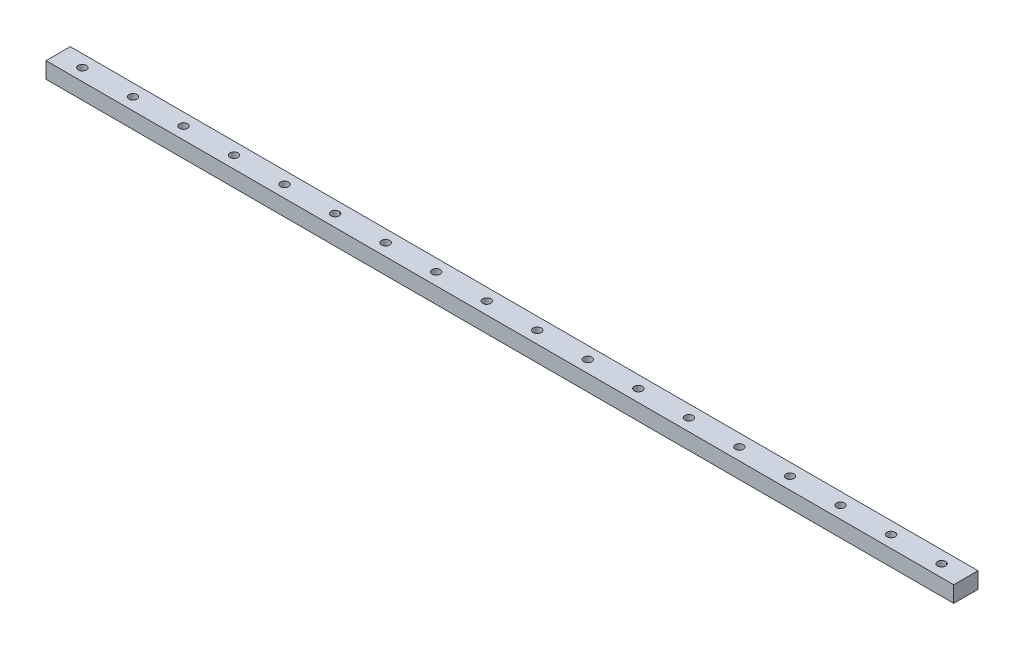
ISO-10303-21;
HEADER;
FILE_DESCRIPTION(('STEP AP214'),'2;1');
FILE_NAME('part.step','',(''),(''),'','','');
FILE_SCHEMA(('AUTOMOTIVE_DESIGN { 1 0 10303 214 1 1 1 1 }'));
ENDSEC;
DATA;
#1=APPLICATION_CONTEXT('core data for automotive mechanical design processes');
#2=APPLICATION_PROTOCOL_DEFINITION('international standard','automotive_design',2000,#1);
#3=PRODUCT_CONTEXT('',#1,'mechanical');
#4=PRODUCT('Part','Part','',(#3));
#5=PRODUCT_RELATED_PRODUCT_CATEGORY('part','',(#4));
#6=PRODUCT_DEFINITION_FORMATION('','',#4);
#7=PRODUCT_DEFINITION_CONTEXT('part definition',#1,'design');
#8=PRODUCT_DEFINITION('design','',#6,#7);
#9=PRODUCT_DEFINITION_SHAPE('','',#8);
#10=(LENGTH_UNIT() NAMED_UNIT(*) SI_UNIT(.MILLI.,.METRE.));
#11=(NAMED_UNIT(*) PLANE_ANGLE_UNIT() SI_UNIT($,.RADIAN.));
#12=(NAMED_UNIT(*) SI_UNIT($,.STERADIAN.) SOLID_ANGLE_UNIT());
#13=UNCERTAINTY_MEASURE_WITH_UNIT(LENGTH_MEASURE(1.E-05),#10,'distance_accuracy_value','');
#14=(GEOMETRIC_REPRESENTATION_CONTEXT(3) GLOBAL_UNCERTAINTY_ASSIGNED_CONTEXT((#13)) GLOBAL_UNIT_ASSIGNED_CONTEXT((#10,
#11,#12)) REPRESENTATION_CONTEXT('',''));
#15=CARTESIAN_POINT('',(0.,0.,0.));
#16=DIRECTION('',(0.,0.,1.));
#17=DIRECTION('',(1.,0.,0.));
#18=AXIS2_PLACEMENT_3D('',#15,#16,#17);
#19=CARTESIAN_POINT('',(0.,8.,0.));
#20=DIRECTION('',(0.,-1.,0.));
#21=DIRECTION('',(0.,0.,-1.));
#22=AXIS2_PLACEMENT_3D('',#19,#20,#21);
#23=PLANE('',#22);
#24=DIRECTION('',(0.,0.,1.));
#25=VECTOR('',#24,1.);
#26=CARTESIAN_POINT('',(0.,8.,0.));
#27=LINE('',#26,#25);
#28=CARTESIAN_POINT('',(0.,8.,-12.));
#29=VERTEX_POINT('',#28);
#30=CARTESIAN_POINT('',(0.,8.,0.));
#31=VERTEX_POINT('',#30);
#32=EDGE_CURVE('E98',#29,#31,#27,.T.);
#33=ORIENTED_EDGE('',*,*,#32,.T.);
#34=DIRECTION('',(1.,0.,0.));
#35=VECTOR('',#34,1.);
#36=CARTESIAN_POINT('',(0.,8.,0.));
#37=LINE('',#36,#35);
#38=CARTESIAN_POINT('',(449.,8.,0.));
#39=VERTEX_POINT('',#38);
#40=EDGE_CURVE('E93',#31,#39,#37,.T.);
#41=ORIENTED_EDGE('',*,*,#40,.T.);
#42=DIRECTION('',(0.,0.,-1.));
#43=VECTOR('',#42,1.);
#44=CARTESIAN_POINT('',(449.,8.,0.));
#45=LINE('',#44,#43);
#46=CARTESIAN_POINT('',(449.,8.,-12.));
#47=VERTEX_POINT('',#46);
#48=EDGE_CURVE('E96',#39,#47,#45,.T.);
#49=ORIENTED_EDGE('',*,*,#48,.T.);
#50=DIRECTION('',(-1.,0.,0.));
#51=VECTOR('',#50,1.);
#52=CARTESIAN_POINT('',(0.,8.,-12.));
#53=LINE('',#52,#51);
#54=EDGE_CURVE('E63',#47,#29,#53,.T.);
#55=ORIENTED_EDGE('',*,*,#54,.T.);
#56=EDGE_LOOP('',(#33,#41,#49,#55));
#57=FACE_BOUND('',#56,.T.);
#58=CARTESIAN_POINT('',(12.,8.,-6.));
#59=DIRECTION('',(0.,1.,0.));
#60=DIRECTION('',(0.,0.,1.));
#61=AXIS2_PLACEMENT_3D('',#58,#59,#60);
#62=CIRCLE('',#61,2.);
#63=CARTESIAN_POINT('',(12.,8.,-4.));
#64=VERTEX_POINT('',#63);
#65=EDGE_CURVE('E118',#64,#64,#62,.T.);
#66=ORIENTED_EDGE('',*,*,#65,.F.);
#67=EDGE_LOOP('',(#66));
#68=FACE_BOUND('',#67,.T.);
#69=CARTESIAN_POINT('',(37.,8.,-6.));
#70=DIRECTION('',(0.,1.,0.));
#71=DIRECTION('',(0.,0.,1.));
#72=AXIS2_PLACEMENT_3D('',#69,#70,#71);
#73=CIRCLE('',#72,2.);
#74=CARTESIAN_POINT('',(37.,8.,-4.));
#75=VERTEX_POINT('',#74);
#76=EDGE_CURVE('E140',#75,#75,#73,.T.);
#77=ORIENTED_EDGE('',*,*,#76,.F.);
#78=EDGE_LOOP('',(#77));
#79=FACE_BOUND('',#78,.T.);
#80=CARTESIAN_POINT('',(62.,8.,-6.));
#81=DIRECTION('',(0.,1.,0.));
#82=DIRECTION('',(0.,0.,1.));
#83=AXIS2_PLACEMENT_3D('',#80,#81,#82);
#84=CIRCLE('',#83,2.);
#85=CARTESIAN_POINT('',(62.,8.,-4.));
#86=VERTEX_POINT('',#85);
#87=EDGE_CURVE('E148',#86,#86,#84,.T.);
#88=ORIENTED_EDGE('',*,*,#87,.F.);
#89=EDGE_LOOP('',(#88));
#90=FACE_BOUND('',#89,.T.);
#91=CARTESIAN_POINT('',(87.,8.,-6.));
#92=DIRECTION('',(0.,1.,0.));
#93=DIRECTION('',(0.,0.,1.));
#94=AXIS2_PLACEMENT_3D('',#91,#92,#93);
#95=CIRCLE('',#94,2.00000000000001);
#96=CARTESIAN_POINT('',(87.,8.,-3.99999999999999));
#97=VERTEX_POINT('',#96);
#98=EDGE_CURVE('E156',#97,#97,#95,.T.);
#99=ORIENTED_EDGE('',*,*,#98,.F.);
#100=EDGE_LOOP('',(#99));
#101=FACE_BOUND('',#100,.T.);
#102=CARTESIAN_POINT('',(112.,8.,-6.));
#103=DIRECTION('',(0.,1.,0.));
#104=DIRECTION('',(0.,0.,1.));
#105=AXIS2_PLACEMENT_3D('',#102,#103,#104);
#106=CIRCLE('',#105,2.00000000000001);
#107=CARTESIAN_POINT('',(112.,8.,-3.99999999999999));
#108=VERTEX_POINT('',#107);
#109=EDGE_CURVE('E164',#108,#108,#106,.T.);
#110=ORIENTED_EDGE('',*,*,#109,.F.);
#111=EDGE_LOOP('',(#110));
#112=FACE_BOUND('',#111,.T.);
#113=CARTESIAN_POINT('',(137.,8.,-6.));
#114=DIRECTION('',(0.,1.,0.));
#115=DIRECTION('',(0.,0.,1.));
#116=AXIS2_PLACEMENT_3D('',#113,#114,#115);
#117=CIRCLE('',#116,2.);
#118=CARTESIAN_POINT('',(137.,8.,-4.));
#119=VERTEX_POINT('',#118);
#120=EDGE_CURVE('E172',#119,#119,#117,.T.);
#121=ORIENTED_EDGE('',*,*,#120,.F.);
#122=EDGE_LOOP('',(#121));
#123=FACE_BOUND('',#122,.T.);
#124=CARTESIAN_POINT('',(162.,8.,-6.));
#125=DIRECTION('',(0.,1.,0.));
#126=DIRECTION('',(0.,0.,1.));
#127=AXIS2_PLACEMENT_3D('',#124,#125,#126);
#128=CIRCLE('',#127,2.);
#129=CARTESIAN_POINT('',(162.,8.,-4.));
#130=VERTEX_POINT('',#129);
#131=EDGE_CURVE('E180',#130,#130,#128,.T.);
#132=ORIENTED_EDGE('',*,*,#131,.F.);
#133=EDGE_LOOP('',(#132));
#134=FACE_BOUND('',#133,.T.);
#135=CARTESIAN_POINT('',(187.,8.,-6.));
#136=DIRECTION('',(0.,1.,0.));
#137=DIRECTION('',(0.,0.,1.));
#138=AXIS2_PLACEMENT_3D('',#135,#136,#137);
#139=CIRCLE('',#138,2.);
#140=CARTESIAN_POINT('',(187.,8.,-4.));
#141=VERTEX_POINT('',#140);
#142=EDGE_CURVE('E188',#141,#141,#139,.T.);
#143=ORIENTED_EDGE('',*,*,#142,.F.);
#144=EDGE_LOOP('',(#143));
#145=FACE_BOUND('',#144,.T.);
#146=CARTESIAN_POINT('',(212.,8.,-6.));
#147=DIRECTION('',(0.,1.,0.));
#148=DIRECTION('',(0.,0.,1.));
#149=AXIS2_PLACEMENT_3D('',#146,#147,#148);
#150=CIRCLE('',#149,2.);
#151=CARTESIAN_POINT('',(212.,8.,-4.));
#152=VERTEX_POINT('',#151);
#153=EDGE_CURVE('E196',#152,#152,#150,.T.);
#154=ORIENTED_EDGE('',*,*,#153,.F.);
#155=EDGE_LOOP('',(#154));
#156=FACE_BOUND('',#155,.T.);
#157=CARTESIAN_POINT('',(237.,8.,-6.));
#158=DIRECTION('',(0.,1.,0.));
#159=DIRECTION('',(0.,0.,1.));
#160=AXIS2_PLACEMENT_3D('',#157,#158,#159);
#161=CIRCLE('',#160,2.);
#162=CARTESIAN_POINT('',(237.,8.,-4.));
#163=VERTEX_POINT('',#162);
#164=EDGE_CURVE('E204',#163,#163,#161,.T.);
#165=ORIENTED_EDGE('',*,*,#164,.F.);
#166=EDGE_LOOP('',(#165));
#167=FACE_BOUND('',#166,.T.);
#168=CARTESIAN_POINT('',(262.,8.,-6.));
#169=DIRECTION('',(0.,1.,0.));
#170=DIRECTION('',(0.,0.,1.));
#171=AXIS2_PLACEMENT_3D('',#168,#169,#170);
#172=CIRCLE('',#171,2.);
#173=CARTESIAN_POINT('',(262.,8.,-4.));
#174=VERTEX_POINT('',#173);
#175=EDGE_CURVE('E212',#174,#174,#172,.T.);
#176=ORIENTED_EDGE('',*,*,#175,.F.);
#177=EDGE_LOOP('',(#176));
#178=FACE_BOUND('',#177,.T.);
#179=CARTESIAN_POINT('',(287.,8.,-6.));
#180=DIRECTION('',(0.,1.,0.));
#181=DIRECTION('',(0.,0.,1.));
#182=AXIS2_PLACEMENT_3D('',#179,#180,#181);
#183=CIRCLE('',#182,2.);
#184=CARTESIAN_POINT('',(287.,8.,-4.));
#185=VERTEX_POINT('',#184);
#186=EDGE_CURVE('E220',#185,#185,#183,.T.);
#187=ORIENTED_EDGE('',*,*,#186,.F.);
#188=EDGE_LOOP('',(#187));
#189=FACE_BOUND('',#188,.T.);
#190=CARTESIAN_POINT('',(312.,8.,-6.));
#191=DIRECTION('',(0.,1.,0.));
#192=DIRECTION('',(0.,0.,1.));
#193=AXIS2_PLACEMENT_3D('',#190,#191,#192);
#194=CIRCLE('',#193,2.);
#195=CARTESIAN_POINT('',(312.,8.,-4.));
#196=VERTEX_POINT('',#195);
#197=EDGE_CURVE('E228',#196,#196,#194,.T.);
#198=ORIENTED_EDGE('',*,*,#197,.F.);
#199=EDGE_LOOP('',(#198));
#200=FACE_BOUND('',#199,.T.);
#201=CARTESIAN_POINT('',(337.,8.,-6.));
#202=DIRECTION('',(0.,1.,0.));
#203=DIRECTION('',(0.,0.,1.));
#204=AXIS2_PLACEMENT_3D('',#201,#202,#203);
#205=CIRCLE('',#204,2.);
#206=CARTESIAN_POINT('',(337.,8.,-4.));
#207=VERTEX_POINT('',#206);
#208=EDGE_CURVE('E236',#207,#207,#205,.T.);
#209=ORIENTED_EDGE('',*,*,#208,.F.);
#210=EDGE_LOOP('',(#209));
#211=FACE_BOUND('',#210,.T.);
#212=CARTESIAN_POINT('',(362.,8.,-6.));
#213=DIRECTION('',(0.,1.,0.));
#214=DIRECTION('',(0.,0.,1.));
#215=AXIS2_PLACEMENT_3D('',#212,#213,#214);
#216=CIRCLE('',#215,2.);
#217=CARTESIAN_POINT('',(362.,8.,-4.));
#218=VERTEX_POINT('',#217);
#219=EDGE_CURVE('E244',#218,#218,#216,.T.);
#220=ORIENTED_EDGE('',*,*,#219,.F.);
#221=EDGE_LOOP('',(#220));
#222=FACE_BOUND('',#221,.T.);
#223=CARTESIAN_POINT('',(387.,8.,-6.));
#224=DIRECTION('',(0.,1.,0.));
#225=DIRECTION('',(0.,0.,1.));
#226=AXIS2_PLACEMENT_3D('',#223,#224,#225);
#227=CIRCLE('',#226,2.);
#228=CARTESIAN_POINT('',(387.,8.,-4.));
#229=VERTEX_POINT('',#228);
#230=EDGE_CURVE('E252',#229,#229,#227,.T.);
#231=ORIENTED_EDGE('',*,*,#230,.F.);
#232=EDGE_LOOP('',(#231));
#233=FACE_BOUND('',#232,.T.);
#234=CARTESIAN_POINT('',(412.,8.,-6.));
#235=DIRECTION('',(0.,1.,0.));
#236=DIRECTION('',(0.,0.,1.));
#237=AXIS2_PLACEMENT_3D('',#234,#235,#236);
#238=CIRCLE('',#237,2.);
#239=CARTESIAN_POINT('',(412.,8.,-4.));
#240=VERTEX_POINT('',#239);
#241=EDGE_CURVE('E260',#240,#240,#238,.T.);
#242=ORIENTED_EDGE('',*,*,#241,.F.);
#243=EDGE_LOOP('',(#242));
#244=FACE_BOUND('',#243,.T.);
#245=CARTESIAN_POINT('',(437.,8.,-6.));
#246=DIRECTION('',(0.,1.,0.));
#247=DIRECTION('',(0.,0.,1.));
#248=AXIS2_PLACEMENT_3D('',#245,#246,#247);
#249=CIRCLE('',#248,2.);
#250=CARTESIAN_POINT('',(437.,8.,-4.));
#251=VERTEX_POINT('',#250);
#252=EDGE_CURVE('E268',#251,#251,#249,.T.);
#253=ORIENTED_EDGE('',*,*,#252,.F.);
#254=EDGE_LOOP('',(#253));
#255=FACE_BOUND('',#254,.T.);
#256=ADVANCED_FACE('F45',(#57,#68,#79,#90,#101,#112,#123,#134,#145,#156,#167,#178,#189,#200,
#211,#222,#233,#244,#255),#23,.F.);
#257=CARTESIAN_POINT('',(0.,0.,0.));
#258=DIRECTION('',(0.,-1.,0.));
#259=DIRECTION('',(0.,0.,-1.));
#260=AXIS2_PLACEMENT_3D('',#257,#258,#259);
#261=PLANE('',#260);
#262=CARTESIAN_POINT('',(412.,0.,-6.));
#263=DIRECTION('',(0.,1.,0.));
#264=DIRECTION('',(0.,0.,1.));
#265=AXIS2_PLACEMENT_3D('',#262,#263,#264);
#266=CIRCLE('',#265,2.);
#267=CARTESIAN_POINT('',(412.,0.,-4.));
#268=VERTEX_POINT('',#267);
#269=EDGE_CURVE('E264',#268,#268,#266,.T.);
#270=ORIENTED_EDGE('',*,*,#269,.T.);
#271=EDGE_LOOP('',(#270));
#272=FACE_BOUND('',#271,.T.);
#273=CARTESIAN_POINT('',(362.,0.,-6.));
#274=DIRECTION('',(0.,1.,0.));
#275=DIRECTION('',(0.,0.,1.));
#276=AXIS2_PLACEMENT_3D('',#273,#274,#275);
#277=CIRCLE('',#276,2.);
#278=CARTESIAN_POINT('',(362.,0.,-4.));
#279=VERTEX_POINT('',#278);
#280=EDGE_CURVE('E248',#279,#279,#277,.T.);
#281=ORIENTED_EDGE('',*,*,#280,.T.);
#282=EDGE_LOOP('',(#281));
#283=FACE_BOUND('',#282,.T.);
#284=CARTESIAN_POINT('',(312.,0.,-6.));
#285=DIRECTION('',(0.,1.,0.));
#286=DIRECTION('',(0.,0.,1.));
#287=AXIS2_PLACEMENT_3D('',#284,#285,#286);
#288=CIRCLE('',#287,2.);
#289=CARTESIAN_POINT('',(312.,0.,-4.));
#290=VERTEX_POINT('',#289);
#291=EDGE_CURVE('E232',#290,#290,#288,.T.);
#292=ORIENTED_EDGE('',*,*,#291,.T.);
#293=EDGE_LOOP('',(#292));
#294=FACE_BOUND('',#293,.T.);
#295=CARTESIAN_POINT('',(262.,0.,-6.));
#296=DIRECTION('',(0.,1.,0.));
#297=DIRECTION('',(0.,0.,1.));
#298=AXIS2_PLACEMENT_3D('',#295,#296,#297);
#299=CIRCLE('',#298,2.);
#300=CARTESIAN_POINT('',(262.,0.,-4.));
#301=VERTEX_POINT('',#300);
#302=EDGE_CURVE('E216',#301,#301,#299,.T.);
#303=ORIENTED_EDGE('',*,*,#302,.T.);
#304=EDGE_LOOP('',(#303));
#305=FACE_BOUND('',#304,.T.);
#306=CARTESIAN_POINT('',(212.,0.,-6.));
#307=DIRECTION('',(0.,1.,0.));
#308=DIRECTION('',(0.,0.,1.));
#309=AXIS2_PLACEMENT_3D('',#306,#307,#308);
#310=CIRCLE('',#309,2.);
#311=CARTESIAN_POINT('',(212.,0.,-4.));
#312=VERTEX_POINT('',#311);
#313=EDGE_CURVE('E200',#312,#312,#310,.T.);
#314=ORIENTED_EDGE('',*,*,#313,.T.);
#315=EDGE_LOOP('',(#314));
#316=FACE_BOUND('',#315,.T.);
#317=CARTESIAN_POINT('',(162.,0.,-6.));
#318=DIRECTION('',(0.,1.,0.));
#319=DIRECTION('',(0.,0.,1.));
#320=AXIS2_PLACEMENT_3D('',#317,#318,#319);
#321=CIRCLE('',#320,2.);
#322=CARTESIAN_POINT('',(162.,0.,-4.));
#323=VERTEX_POINT('',#322);
#324=EDGE_CURVE('E184',#323,#323,#321,.T.);
#325=ORIENTED_EDGE('',*,*,#324,.T.);
#326=EDGE_LOOP('',(#325));
#327=FACE_BOUND('',#326,.T.);
#328=CARTESIAN_POINT('',(112.,0.,-6.));
#329=DIRECTION('',(0.,1.,0.));
#330=DIRECTION('',(0.,0.,1.));
#331=AXIS2_PLACEMENT_3D('',#328,#329,#330);
#332=CIRCLE('',#331,2.00000000000001);
#333=CARTESIAN_POINT('',(112.,0.,-3.99999999999999));
#334=VERTEX_POINT('',#333);
#335=EDGE_CURVE('E168',#334,#334,#332,.T.);
#336=ORIENTED_EDGE('',*,*,#335,.T.);
#337=EDGE_LOOP('',(#336));
#338=FACE_BOUND('',#337,.T.);
#339=CARTESIAN_POINT('',(62.,0.,-6.));
#340=DIRECTION('',(0.,1.,0.));
#341=DIRECTION('',(0.,0.,1.));
#342=AXIS2_PLACEMENT_3D('',#339,#340,#341);
#343=CIRCLE('',#342,2.);
#344=CARTESIAN_POINT('',(62.,0.,-4.));
#345=VERTEX_POINT('',#344);
#346=EDGE_CURVE('E152',#345,#345,#343,.T.);
#347=ORIENTED_EDGE('',*,*,#346,.T.);
#348=EDGE_LOOP('',(#347));
#349=FACE_BOUND('',#348,.T.);
#350=CARTESIAN_POINT('',(12.,0.,-6.));
#351=DIRECTION('',(0.,1.,0.));
#352=DIRECTION('',(0.,0.,1.));
#353=AXIS2_PLACEMENT_3D('',#350,#351,#352);
#354=CIRCLE('',#353,2.);
#355=CARTESIAN_POINT('',(12.,0.,-4.));
#356=VERTEX_POINT('',#355);
#357=EDGE_CURVE('E136',#356,#356,#354,.T.);
#358=ORIENTED_EDGE('',*,*,#357,.T.);
#359=EDGE_LOOP('',(#358));
#360=FACE_BOUND('',#359,.T.);
#361=DIRECTION('',(0.,0.,1.));
#362=VECTOR('',#361,1.);
#363=CARTESIAN_POINT('',(0.,0.,0.));
#364=LINE('',#363,#362);
#365=CARTESIAN_POINT('',(0.,0.,-12.));
#366=VERTEX_POINT('',#365);
#367=CARTESIAN_POINT('',(0.,0.,0.));
#368=VERTEX_POINT('',#367);
#369=EDGE_CURVE('E114',#366,#368,#364,.T.);
#370=ORIENTED_EDGE('',*,*,#369,.F.);
#371=DIRECTION('',(-1.,0.,0.));
#372=VECTOR('',#371,1.);
#373=CARTESIAN_POINT('',(0.,0.,-12.));
#374=LINE('',#373,#372);
#375=CARTESIAN_POINT('',(449.,0.,-12.));
#376=VERTEX_POINT('',#375);
#377=EDGE_CURVE('E86',#376,#366,#374,.T.);
#378=ORIENTED_EDGE('',*,*,#377,.F.);
#379=DIRECTION('',(0.,0.,-1.));
#380=VECTOR('',#379,1.);
#381=CARTESIAN_POINT('',(449.,0.,0.));
#382=LINE('',#381,#380);
#383=CARTESIAN_POINT('',(449.,0.,0.));
#384=VERTEX_POINT('',#383);
#385=EDGE_CURVE('E80',#384,#376,#382,.T.);
#386=ORIENTED_EDGE('',*,*,#385,.F.);
#387=DIRECTION('',(1.,0.,0.));
#388=VECTOR('',#387,1.);
#389=CARTESIAN_POINT('',(0.,0.,0.));
#390=LINE('',#389,#388);
#391=EDGE_CURVE('E103',#368,#384,#390,.T.);
#392=ORIENTED_EDGE('',*,*,#391,.F.);
#393=EDGE_LOOP('',(#370,#378,#386,#392));
#394=FACE_BOUND('',#393,.T.);
#395=CARTESIAN_POINT('',(37.,0.,-6.));
#396=DIRECTION('',(0.,1.,0.));
#397=DIRECTION('',(0.,0.,1.));
#398=AXIS2_PLACEMENT_3D('',#395,#396,#397);
#399=CIRCLE('',#398,2.);
#400=CARTESIAN_POINT('',(37.,0.,-4.));
#401=VERTEX_POINT('',#400);
#402=EDGE_CURVE('E144',#401,#401,#399,.T.);
#403=ORIENTED_EDGE('',*,*,#402,.T.);
#404=EDGE_LOOP('',(#403));
#405=FACE_BOUND('',#404,.T.);
#406=CARTESIAN_POINT('',(87.,0.,-6.));
#407=DIRECTION('',(0.,1.,0.));
#408=DIRECTION('',(0.,0.,1.));
#409=AXIS2_PLACEMENT_3D('',#406,#407,#408);
#410=CIRCLE('',#409,2.00000000000001);
#411=CARTESIAN_POINT('',(87.,0.,-3.99999999999999));
#412=VERTEX_POINT('',#411);
#413=EDGE_CURVE('E160',#412,#412,#410,.T.);
#414=ORIENTED_EDGE('',*,*,#413,.T.);
#415=EDGE_LOOP('',(#414));
#416=FACE_BOUND('',#415,.T.);
#417=CARTESIAN_POINT('',(137.,0.,-6.));
#418=DIRECTION('',(0.,1.,0.));
#419=DIRECTION('',(0.,0.,1.));
#420=AXIS2_PLACEMENT_3D('',#417,#418,#419);
#421=CIRCLE('',#420,2.);
#422=CARTESIAN_POINT('',(137.,0.,-4.));
#423=VERTEX_POINT('',#422);
#424=EDGE_CURVE('E176',#423,#423,#421,.T.);
#425=ORIENTED_EDGE('',*,*,#424,.T.);
#426=EDGE_LOOP('',(#425));
#427=FACE_BOUND('',#426,.T.);
#428=CARTESIAN_POINT('',(187.,0.,-6.));
#429=DIRECTION('',(0.,1.,0.));
#430=DIRECTION('',(0.,0.,1.));
#431=AXIS2_PLACEMENT_3D('',#428,#429,#430);
#432=CIRCLE('',#431,2.);
#433=CARTESIAN_POINT('',(187.,0.,-4.));
#434=VERTEX_POINT('',#433);
#435=EDGE_CURVE('E192',#434,#434,#432,.T.);
#436=ORIENTED_EDGE('',*,*,#435,.T.);
#437=EDGE_LOOP('',(#436));
#438=FACE_BOUND('',#437,.T.);
#439=CARTESIAN_POINT('',(237.,0.,-6.));
#440=DIRECTION('',(0.,1.,0.));
#441=DIRECTION('',(0.,0.,1.));
#442=AXIS2_PLACEMENT_3D('',#439,#440,#441);
#443=CIRCLE('',#442,2.);
#444=CARTESIAN_POINT('',(237.,0.,-4.));
#445=VERTEX_POINT('',#444);
#446=EDGE_CURVE('E208',#445,#445,#443,.T.);
#447=ORIENTED_EDGE('',*,*,#446,.T.);
#448=EDGE_LOOP('',(#447));
#449=FACE_BOUND('',#448,.T.);
#450=CARTESIAN_POINT('',(287.,0.,-6.));
#451=DIRECTION('',(0.,1.,0.));
#452=DIRECTION('',(0.,0.,1.));
#453=AXIS2_PLACEMENT_3D('',#450,#451,#452);
#454=CIRCLE('',#453,2.);
#455=CARTESIAN_POINT('',(287.,0.,-4.));
#456=VERTEX_POINT('',#455);
#457=EDGE_CURVE('E224',#456,#456,#454,.T.);
#458=ORIENTED_EDGE('',*,*,#457,.T.);
#459=EDGE_LOOP('',(#458));
#460=FACE_BOUND('',#459,.T.);
#461=CARTESIAN_POINT('',(337.,0.,-6.));
#462=DIRECTION('',(0.,1.,0.));
#463=DIRECTION('',(0.,0.,1.));
#464=AXIS2_PLACEMENT_3D('',#461,#462,#463);
#465=CIRCLE('',#464,2.);
#466=CARTESIAN_POINT('',(337.,0.,-4.));
#467=VERTEX_POINT('',#466);
#468=EDGE_CURVE('E240',#467,#467,#465,.T.);
#469=ORIENTED_EDGE('',*,*,#468,.T.);
#470=EDGE_LOOP('',(#469));
#471=FACE_BOUND('',#470,.T.);
#472=CARTESIAN_POINT('',(387.,0.,-6.));
#473=DIRECTION('',(0.,1.,0.));
#474=DIRECTION('',(0.,0.,1.));
#475=AXIS2_PLACEMENT_3D('',#472,#473,#474);
#476=CIRCLE('',#475,2.);
#477=CARTESIAN_POINT('',(387.,0.,-4.));
#478=VERTEX_POINT('',#477);
#479=EDGE_CURVE('E256',#478,#478,#476,.T.);
#480=ORIENTED_EDGE('',*,*,#479,.T.);
#481=EDGE_LOOP('',(#480));
#482=FACE_BOUND('',#481,.T.);
#483=CARTESIAN_POINT('',(437.,0.,-6.));
#484=DIRECTION('',(0.,1.,0.));
#485=DIRECTION('',(0.,0.,1.));
#486=AXIS2_PLACEMENT_3D('',#483,#484,#485);
#487=CIRCLE('',#486,2.);
#488=CARTESIAN_POINT('',(437.,0.,-4.));
#489=VERTEX_POINT('',#488);
#490=EDGE_CURVE('E272',#489,#489,#487,.T.);
#491=ORIENTED_EDGE('',*,*,#490,.T.);
#492=EDGE_LOOP('',(#491));
#493=FACE_BOUND('',#492,.T.);
#494=ADVANCED_FACE('F131',(#272,#283,#294,#305,#316,#327,#338,#349,#360,#394,#405,#416,#427,
#438,#449,#460,#471,#482,#493),#261,.T.);
#495=CARTESIAN_POINT('',(0.,8.,0.));
#496=DIRECTION('',(1.,0.,0.));
#497=DIRECTION('',(0.,0.,-1.));
#498=AXIS2_PLACEMENT_3D('',#495,#496,#497);
#499=PLANE('',#498);
#500=ORIENTED_EDGE('',*,*,#369,.T.);
#501=DIRECTION('',(0.,-1.,0.));
#502=VECTOR('',#501,1.);
#503=CARTESIAN_POINT('',(0.,8.,0.));
#504=LINE('',#503,#502);
#505=EDGE_CURVE('E11',#31,#368,#504,.T.);
#506=ORIENTED_EDGE('',*,*,#505,.F.);
#507=ORIENTED_EDGE('',*,*,#32,.F.);
#508=DIRECTION('',(0.,-1.,0.));
#509=VECTOR('',#508,1.);
#510=CARTESIAN_POINT('',(0.,8.,-12.));
#511=LINE('',#510,#509);
#512=EDGE_CURVE('E110',#29,#366,#511,.T.);
#513=ORIENTED_EDGE('',*,*,#512,.T.);
#514=EDGE_LOOP('',(#500,#506,#507,#513));
#515=FACE_BOUND('',#514,.T.);
#516=ADVANCED_FACE('F47',(#515),#499,.F.);
#517=CARTESIAN_POINT('',(0.,8.,0.));
#518=DIRECTION('',(0.,0.,-1.));
#519=DIRECTION('',(-1.,0.,0.));
#520=AXIS2_PLACEMENT_3D('',#517,#518,#519);
#521=PLANE('',#520);
#522=ORIENTED_EDGE('',*,*,#391,.T.);
#523=DIRECTION('',(0.,-1.,0.));
#524=VECTOR('',#523,1.);
#525=CARTESIAN_POINT('',(449.,8.,0.));
#526=LINE('',#525,#524);
#527=EDGE_CURVE('E55',#39,#384,#526,.T.);
#528=ORIENTED_EDGE('',*,*,#527,.F.);
#529=ORIENTED_EDGE('',*,*,#40,.F.);
#530=ORIENTED_EDGE('',*,*,#505,.T.);
#531=EDGE_LOOP('',(#522,#528,#529,#530));
#532=FACE_BOUND('',#531,.T.);
#533=ADVANCED_FACE('F102',(#532),#521,.F.);
#534=CARTESIAN_POINT('',(449.,8.,0.));
#535=DIRECTION('',(-1.,0.,0.));
#536=DIRECTION('',(0.,0.,1.));
#537=AXIS2_PLACEMENT_3D('',#534,#535,#536);
#538=PLANE('',#537);
#539=ORIENTED_EDGE('',*,*,#385,.T.);
#540=DIRECTION('',(0.,-1.,0.));
#541=VECTOR('',#540,1.);
#542=CARTESIAN_POINT('',(449.,8.,-12.));
#543=LINE('',#542,#541);
#544=EDGE_CURVE('E105',#47,#376,#543,.T.);
#545=ORIENTED_EDGE('',*,*,#544,.F.);
#546=ORIENTED_EDGE('',*,*,#48,.F.);
#547=ORIENTED_EDGE('',*,*,#527,.T.);
#548=EDGE_LOOP('',(#539,#545,#546,#547));
#549=FACE_BOUND('',#548,.T.);
#550=ADVANCED_FACE('F106',(#549),#538,.F.);
#551=CARTESIAN_POINT('',(0.,8.,-12.));
#552=DIRECTION('',(0.,0.,1.));
#553=DIRECTION('',(1.,0.,0.));
#554=AXIS2_PLACEMENT_3D('',#551,#552,#553);
#555=PLANE('',#554);
#556=ORIENTED_EDGE('',*,*,#377,.T.);
#557=ORIENTED_EDGE('',*,*,#512,.F.);
#558=ORIENTED_EDGE('',*,*,#54,.F.);
#559=ORIENTED_EDGE('',*,*,#544,.T.);
#560=EDGE_LOOP('',(#556,#557,#558,#559));
#561=FACE_BOUND('',#560,.T.);
#562=ADVANCED_FACE('F128',(#561),#555,.F.);
#563=CARTESIAN_POINT('',(12.,8.,-6.));
#564=DIRECTION('',(0.,-1.,0.));
#565=DIRECTION('',(0.,0.,-1.));
#566=AXIS2_PLACEMENT_3D('',#563,#564,#565);
#567=CYLINDRICAL_SURFACE('',#566,2.);
#568=ORIENTED_EDGE('',*,*,#65,.T.);
#569=EDGE_LOOP('',(#568));
#570=FACE_BOUND('',#569,.T.);
#571=ORIENTED_EDGE('',*,*,#357,.F.);
#572=EDGE_LOOP('',(#571));
#573=FACE_BOUND('',#572,.T.);
#574=ADVANCED_FACE('F291',(#570,#573),#567,.F.);
#575=CARTESIAN_POINT('',(37.,8.,-6.));
#576=DIRECTION('',(0.,-1.,0.));
#577=DIRECTION('',(0.,0.,-1.));
#578=AXIS2_PLACEMENT_3D('',#575,#576,#577);
#579=CYLINDRICAL_SURFACE('',#578,2.);
#580=ORIENTED_EDGE('',*,*,#76,.T.);
#581=EDGE_LOOP('',(#580));
#582=FACE_BOUND('',#581,.T.);
#583=ORIENTED_EDGE('',*,*,#402,.F.);
#584=EDGE_LOOP('',(#583));
#585=FACE_BOUND('',#584,.T.);
#586=ADVANCED_FACE('F336',(#582,#585),#579,.F.);
#587=CARTESIAN_POINT('',(62.,8.,-6.));
#588=DIRECTION('',(0.,-1.,0.));
#589=DIRECTION('',(0.,0.,-1.));
#590=AXIS2_PLACEMENT_3D('',#587,#588,#589);
#591=CYLINDRICAL_SURFACE('',#590,2.);
#592=ORIENTED_EDGE('',*,*,#87,.T.);
#593=EDGE_LOOP('',(#592));
#594=FACE_BOUND('',#593,.T.);
#595=ORIENTED_EDGE('',*,*,#346,.F.);
#596=EDGE_LOOP('',(#595));
#597=FACE_BOUND('',#596,.T.);
#598=ADVANCED_FACE('F344',(#594,#597),#591,.F.);
#599=CARTESIAN_POINT('',(87.,8.,-6.));
#600=DIRECTION('',(0.,-1.,0.));
#601=DIRECTION('',(0.,0.,-1.));
#602=AXIS2_PLACEMENT_3D('',#599,#600,#601);
#603=CYLINDRICAL_SURFACE('',#602,2.00000000000001);
#604=ORIENTED_EDGE('',*,*,#98,.T.);
#605=EDGE_LOOP('',(#604));
#606=FACE_BOUND('',#605,.T.);
#607=ORIENTED_EDGE('',*,*,#413,.F.);
#608=EDGE_LOOP('',(#607));
#609=FACE_BOUND('',#608,.T.);
#610=ADVANCED_FACE('F352',(#606,#609),#603,.F.);
#611=CARTESIAN_POINT('',(112.,8.,-6.));
#612=DIRECTION('',(0.,-1.,0.));
#613=DIRECTION('',(0.,0.,-1.));
#614=AXIS2_PLACEMENT_3D('',#611,#612,#613);
#615=CYLINDRICAL_SURFACE('',#614,2.00000000000001);
#616=ORIENTED_EDGE('',*,*,#109,.T.);
#617=EDGE_LOOP('',(#616));
#618=FACE_BOUND('',#617,.T.);
#619=ORIENTED_EDGE('',*,*,#335,.F.);
#620=EDGE_LOOP('',(#619));
#621=FACE_BOUND('',#620,.T.);
#622=ADVANCED_FACE('F361',(#618,#621),#615,.F.);
#623=CARTESIAN_POINT('',(137.,8.,-6.));
#624=DIRECTION('',(0.,-1.,0.));
#625=DIRECTION('',(0.,0.,-1.));
#626=AXIS2_PLACEMENT_3D('',#623,#624,#625);
#627=CYLINDRICAL_SURFACE('',#626,2.);
#628=ORIENTED_EDGE('',*,*,#120,.T.);
#629=EDGE_LOOP('',(#628));
#630=FACE_BOUND('',#629,.T.);
#631=ORIENTED_EDGE('',*,*,#424,.F.);
#632=EDGE_LOOP('',(#631));
#633=FACE_BOUND('',#632,.T.);
#634=ADVANCED_FACE('F370',(#630,#633),#627,.F.);
#635=CARTESIAN_POINT('',(162.,8.,-6.));
#636=DIRECTION('',(0.,-1.,0.));
#637=DIRECTION('',(0.,0.,-1.));
#638=AXIS2_PLACEMENT_3D('',#635,#636,#637);
#639=CYLINDRICAL_SURFACE('',#638,2.);
#640=ORIENTED_EDGE('',*,*,#131,.T.);
#641=EDGE_LOOP('',(#640));
#642=FACE_BOUND('',#641,.T.);
#643=ORIENTED_EDGE('',*,*,#324,.F.);
#644=EDGE_LOOP('',(#643));
#645=FACE_BOUND('',#644,.T.);
#646=ADVANCED_FACE('F379',(#642,#645),#639,.F.);
#647=CARTESIAN_POINT('',(187.,8.,-6.));
#648=DIRECTION('',(0.,-1.,0.));
#649=DIRECTION('',(0.,0.,-1.));
#650=AXIS2_PLACEMENT_3D('',#647,#648,#649);
#651=CYLINDRICAL_SURFACE('',#650,2.);
#652=ORIENTED_EDGE('',*,*,#142,.T.);
#653=EDGE_LOOP('',(#652));
#654=FACE_BOUND('',#653,.T.);
#655=ORIENTED_EDGE('',*,*,#435,.F.);
#656=EDGE_LOOP('',(#655));
#657=FACE_BOUND('',#656,.T.);
#658=ADVANCED_FACE('F388',(#654,#657),#651,.F.);
#659=CARTESIAN_POINT('',(212.,8.,-6.));
#660=DIRECTION('',(0.,-1.,0.));
#661=DIRECTION('',(0.,0.,-1.));
#662=AXIS2_PLACEMENT_3D('',#659,#660,#661);
#663=CYLINDRICAL_SURFACE('',#662,2.);
#664=ORIENTED_EDGE('',*,*,#153,.T.);
#665=EDGE_LOOP('',(#664));
#666=FACE_BOUND('',#665,.T.);
#667=ORIENTED_EDGE('',*,*,#313,.F.);
#668=EDGE_LOOP('',(#667));
#669=FACE_BOUND('',#668,.T.);
#670=ADVANCED_FACE('F397',(#666,#669),#663,.F.);
#671=CARTESIAN_POINT('',(237.,8.,-6.));
#672=DIRECTION('',(0.,-1.,0.));
#673=DIRECTION('',(0.,0.,-1.));
#674=AXIS2_PLACEMENT_3D('',#671,#672,#673);
#675=CYLINDRICAL_SURFACE('',#674,2.);
#676=ORIENTED_EDGE('',*,*,#164,.T.);
#677=EDGE_LOOP('',(#676));
#678=FACE_BOUND('',#677,.T.);
#679=ORIENTED_EDGE('',*,*,#446,.F.);
#680=EDGE_LOOP('',(#679));
#681=FACE_BOUND('',#680,.T.);
#682=ADVANCED_FACE('F406',(#678,#681),#675,.F.);
#683=CARTESIAN_POINT('',(262.,8.,-6.));
#684=DIRECTION('',(0.,-1.,0.));
#685=DIRECTION('',(0.,0.,-1.));
#686=AXIS2_PLACEMENT_3D('',#683,#684,#685);
#687=CYLINDRICAL_SURFACE('',#686,2.);
#688=ORIENTED_EDGE('',*,*,#175,.T.);
#689=EDGE_LOOP('',(#688));
#690=FACE_BOUND('',#689,.T.);
#691=ORIENTED_EDGE('',*,*,#302,.F.);
#692=EDGE_LOOP('',(#691));
#693=FACE_BOUND('',#692,.T.);
#694=ADVANCED_FACE('F415',(#690,#693),#687,.F.);
#695=CARTESIAN_POINT('',(287.,8.,-6.));
#696=DIRECTION('',(0.,-1.,0.));
#697=DIRECTION('',(0.,0.,-1.));
#698=AXIS2_PLACEMENT_3D('',#695,#696,#697);
#699=CYLINDRICAL_SURFACE('',#698,2.);
#700=ORIENTED_EDGE('',*,*,#186,.T.);
#701=EDGE_LOOP('',(#700));
#702=FACE_BOUND('',#701,.T.);
#703=ORIENTED_EDGE('',*,*,#457,.F.);
#704=EDGE_LOOP('',(#703));
#705=FACE_BOUND('',#704,.T.);
#706=ADVANCED_FACE('F424',(#702,#705),#699,.F.);
#707=CARTESIAN_POINT('',(312.,8.,-6.));
#708=DIRECTION('',(0.,-1.,0.));
#709=DIRECTION('',(0.,0.,-1.));
#710=AXIS2_PLACEMENT_3D('',#707,#708,#709);
#711=CYLINDRICAL_SURFACE('',#710,2.);
#712=ORIENTED_EDGE('',*,*,#197,.T.);
#713=EDGE_LOOP('',(#712));
#714=FACE_BOUND('',#713,.T.);
#715=ORIENTED_EDGE('',*,*,#291,.F.);
#716=EDGE_LOOP('',(#715));
#717=FACE_BOUND('',#716,.T.);
#718=ADVANCED_FACE('F433',(#714,#717),#711,.F.);
#719=CARTESIAN_POINT('',(337.,8.,-6.));
#720=DIRECTION('',(0.,-1.,0.));
#721=DIRECTION('',(0.,0.,-1.));
#722=AXIS2_PLACEMENT_3D('',#719,#720,#721);
#723=CYLINDRICAL_SURFACE('',#722,2.);
#724=ORIENTED_EDGE('',*,*,#208,.T.);
#725=EDGE_LOOP('',(#724));
#726=FACE_BOUND('',#725,.T.);
#727=ORIENTED_EDGE('',*,*,#468,.F.);
#728=EDGE_LOOP('',(#727));
#729=FACE_BOUND('',#728,.T.);
#730=ADVANCED_FACE('F442',(#726,#729),#723,.F.);
#731=CARTESIAN_POINT('',(362.,8.,-6.));
#732=DIRECTION('',(0.,-1.,0.));
#733=DIRECTION('',(0.,0.,-1.));
#734=AXIS2_PLACEMENT_3D('',#731,#732,#733);
#735=CYLINDRICAL_SURFACE('',#734,2.);
#736=ORIENTED_EDGE('',*,*,#219,.T.);
#737=EDGE_LOOP('',(#736));
#738=FACE_BOUND('',#737,.T.);
#739=ORIENTED_EDGE('',*,*,#280,.F.);
#740=EDGE_LOOP('',(#739));
#741=FACE_BOUND('',#740,.T.);
#742=ADVANCED_FACE('F451',(#738,#741),#735,.F.);
#743=CARTESIAN_POINT('',(387.,8.,-6.));
#744=DIRECTION('',(0.,-1.,0.));
#745=DIRECTION('',(0.,0.,-1.));
#746=AXIS2_PLACEMENT_3D('',#743,#744,#745);
#747=CYLINDRICAL_SURFACE('',#746,2.);
#748=ORIENTED_EDGE('',*,*,#230,.T.);
#749=EDGE_LOOP('',(#748));
#750=FACE_BOUND('',#749,.T.);
#751=ORIENTED_EDGE('',*,*,#479,.F.);
#752=EDGE_LOOP('',(#751));
#753=FACE_BOUND('',#752,.T.);
#754=ADVANCED_FACE('F460',(#750,#753),#747,.F.);
#755=CARTESIAN_POINT('',(412.,8.,-6.));
#756=DIRECTION('',(0.,-1.,0.));
#757=DIRECTION('',(0.,0.,-1.));
#758=AXIS2_PLACEMENT_3D('',#755,#756,#757);
#759=CYLINDRICAL_SURFACE('',#758,2.);
#760=ORIENTED_EDGE('',*,*,#241,.T.);
#761=EDGE_LOOP('',(#760));
#762=FACE_BOUND('',#761,.T.);
#763=ORIENTED_EDGE('',*,*,#269,.F.);
#764=EDGE_LOOP('',(#763));
#765=FACE_BOUND('',#764,.T.);
#766=ADVANCED_FACE('F469',(#762,#765),#759,.F.);
#767=CARTESIAN_POINT('',(437.,8.,-6.));
#768=DIRECTION('',(0.,-1.,0.));
#769=DIRECTION('',(0.,0.,-1.));
#770=AXIS2_PLACEMENT_3D('',#767,#768,#769);
#771=CYLINDRICAL_SURFACE('',#770,2.);
#772=ORIENTED_EDGE('',*,*,#252,.T.);
#773=EDGE_LOOP('',(#772));
#774=FACE_BOUND('',#773,.T.);
#775=ORIENTED_EDGE('',*,*,#490,.F.);
#776=EDGE_LOOP('',(#775));
#777=FACE_BOUND('',#776,.T.);
#778=ADVANCED_FACE('F280',(#774,#777),#771,.F.);
#779=CLOSED_SHELL('',(#256,#494,#516,#533,#550,#562,#574,#586,#598,#610,#622,#634,#646,#658,
#670,#682,#694,#706,#718,#730,#742,#754,#766,#778));
#780=MANIFOLD_SOLID_BREP('B2',#779);
#781=ADVANCED_BREP_SHAPE_REPRESENTATION('',(#18,#780),#14);
#782=SHAPE_DEFINITION_REPRESENTATION(#9,#781);
ENDSEC;
END-ISO-10303-21;
